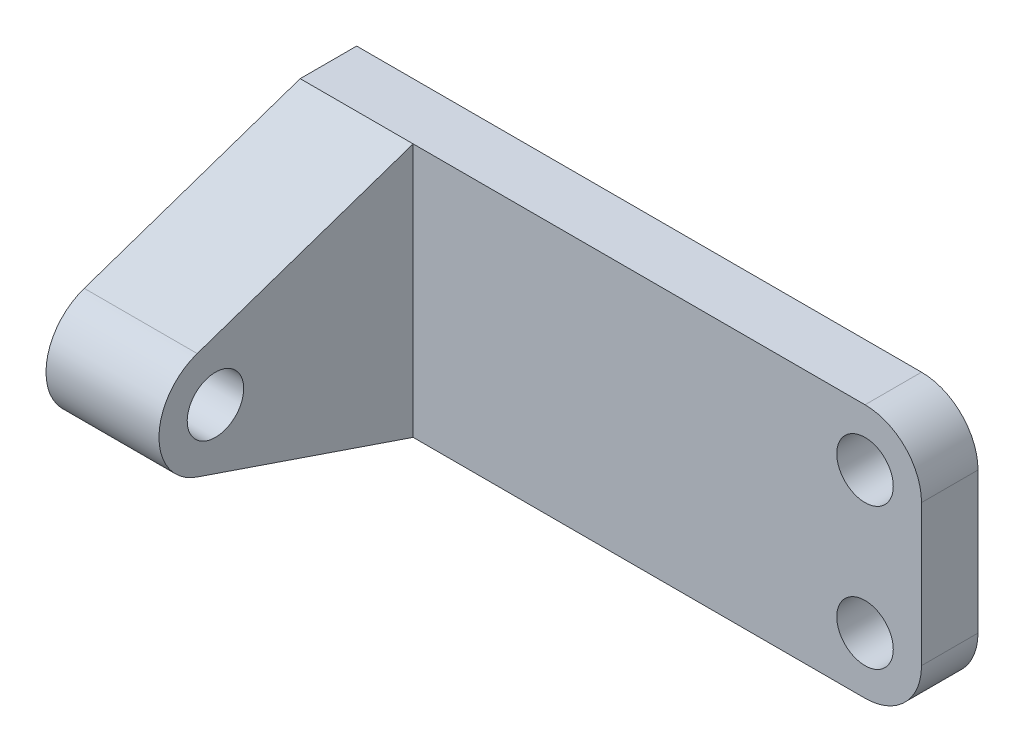
ISO-10303-21;
HEADER;
FILE_DESCRIPTION(('STEP AP214'),'2;1');
FILE_NAME('part.step','',(''),(''),'','','');
FILE_SCHEMA(('AUTOMOTIVE_DESIGN { 1 0 10303 214 1 1 1 1 }'));
ENDSEC;
DATA;
#1=APPLICATION_CONTEXT('core data for automotive mechanical design processes');
#2=APPLICATION_PROTOCOL_DEFINITION('international standard','automotive_design',2000,#1);
#3=PRODUCT_CONTEXT('',#1,'mechanical');
#4=PRODUCT('Part','Part','',(#3));
#5=PRODUCT_RELATED_PRODUCT_CATEGORY('part','',(#4));
#6=PRODUCT_DEFINITION_FORMATION('','',#4);
#7=PRODUCT_DEFINITION_CONTEXT('part definition',#1,'design');
#8=PRODUCT_DEFINITION('design','',#6,#7);
#9=PRODUCT_DEFINITION_SHAPE('','',#8);
#10=(LENGTH_UNIT() NAMED_UNIT(*) SI_UNIT(.MILLI.,.METRE.));
#11=(NAMED_UNIT(*) PLANE_ANGLE_UNIT() SI_UNIT($,.RADIAN.));
#12=(NAMED_UNIT(*) SI_UNIT($,.STERADIAN.) SOLID_ANGLE_UNIT());
#13=UNCERTAINTY_MEASURE_WITH_UNIT(LENGTH_MEASURE(1.E-05),#10,'distance_accuracy_value','');
#14=(GEOMETRIC_REPRESENTATION_CONTEXT(3) GLOBAL_UNCERTAINTY_ASSIGNED_CONTEXT((#13)) GLOBAL_UNIT_ASSIGNED_CONTEXT((#10,
#11,#12)) REPRESENTATION_CONTEXT('',''));
#15=CARTESIAN_POINT('',(0.,0.,0.));
#16=DIRECTION('',(0.,0.,1.));
#17=DIRECTION('',(1.,0.,0.));
#18=AXIS2_PLACEMENT_3D('',#15,#16,#17);
#19=CARTESIAN_POINT('',(72.8066933620451,58.039109346701,12.7));
#20=DIRECTION('',(0.,0.,1.));
#21=DIRECTION('',(1.,0.,0.));
#22=AXIS2_PLACEMENT_3D('',#19,#20,#21);
#23=PLANE('',#22);
#24=DIRECTION('',(0.,1.,0.));
#25=VECTOR('',#24,1.);
#26=CARTESIAN_POINT('',(-28.7933066379549,0.,12.7));
#27=LINE('',#26,#25);
#28=CARTESIAN_POINT('',(-28.7933066379549,13.589109346701,12.7));
#29=VERTEX_POINT('',#28);
#30=CARTESIAN_POINT('',(-28.7933066379549,70.7391093467009,12.7));
#31=VERTEX_POINT('',#30);
#32=EDGE_CURVE('E56',#29,#31,#27,.T.);
#33=ORIENTED_EDGE('',*,*,#32,.F.);
#34=DIRECTION('',(1.,0.,0.));
#35=VECTOR('',#34,1.);
#36=CARTESIAN_POINT('',(-54.1933066379549,13.589109346701,12.7));
#37=LINE('',#36,#35);
#38=CARTESIAN_POINT('',(72.8066933620451,13.589109346701,12.7));
#39=VERTEX_POINT('',#38);
#40=EDGE_CURVE('E107',#29,#39,#37,.T.);
#41=ORIENTED_EDGE('',*,*,#40,.T.);
#42=CARTESIAN_POINT('',(72.8066933620451,26.289109346701,12.7));
#43=DIRECTION('',(0.,0.,1.));
#44=DIRECTION('',(1.,0.,0.));
#45=AXIS2_PLACEMENT_3D('',#42,#43,#44);
#46=CIRCLE('',#45,12.7);
#47=CARTESIAN_POINT('',(85.5066933620451,26.289109346701,12.7));
#48=VERTEX_POINT('',#47);
#49=EDGE_CURVE('E111',#39,#48,#46,.T.);
#50=ORIENTED_EDGE('',*,*,#49,.T.);
#51=DIRECTION('',(0.,1.,0.));
#52=VECTOR('',#51,1.);
#53=CARTESIAN_POINT('',(85.5066933620451,58.039109346701,12.7));
#54=LINE('',#53,#52);
#55=CARTESIAN_POINT('',(85.5066933620451,58.039109346701,12.7));
#56=VERTEX_POINT('',#55);
#57=EDGE_CURVE('E64',#48,#56,#54,.T.);
#58=ORIENTED_EDGE('',*,*,#57,.T.);
#59=CARTESIAN_POINT('',(72.8066933620451,58.039109346701,12.7));
#60=DIRECTION('',(0.,0.,1.));
#61=DIRECTION('',(1.,0.,0.));
#62=AXIS2_PLACEMENT_3D('',#59,#60,#61);
#63=CIRCLE('',#62,12.7);
#64=CARTESIAN_POINT('',(72.8066933620451,70.739109346701,12.7));
#65=VERTEX_POINT('',#64);
#66=EDGE_CURVE('E150',#56,#65,#63,.T.);
#67=ORIENTED_EDGE('',*,*,#66,.T.);
#68=DIRECTION('',(-1.,0.,0.));
#69=VECTOR('',#68,1.);
#70=CARTESIAN_POINT('',(72.8066933620451,70.739109346701,12.7));
#71=LINE('',#70,#69);
#72=EDGE_CURVE('E98',#65,#31,#71,.T.);
#73=ORIENTED_EDGE('',*,*,#72,.T.);
#74=EDGE_LOOP('',(#33,#41,#50,#58,#67,#73));
#75=FACE_BOUND('',#74,.T.);
#76=CARTESIAN_POINT('',(72.8066933620451,58.039109346701,12.7));
#77=DIRECTION('',(0.,0.,1.));
#78=DIRECTION('',(1.,0.,0.));
#79=AXIS2_PLACEMENT_3D('',#76,#77,#78);
#80=CIRCLE('',#79,6.35);
#81=CARTESIAN_POINT('',(79.1566933620451,58.039109346701,12.7));
#82=VERTEX_POINT('',#81);
#83=EDGE_CURVE('E142',#82,#82,#80,.T.);
#84=ORIENTED_EDGE('',*,*,#83,.F.);
#85=EDGE_LOOP('',(#84));
#86=FACE_BOUND('',#85,.T.);
#87=CARTESIAN_POINT('',(72.8066933620451,26.289109346701,12.7));
#88=DIRECTION('',(0.,0.,1.));
#89=DIRECTION('',(1.,0.,0.));
#90=AXIS2_PLACEMENT_3D('',#87,#88,#89);
#91=CIRCLE('',#90,6.35);
#92=CARTESIAN_POINT('',(79.1566933620451,26.289109346701,12.7));
#93=VERTEX_POINT('',#92);
#94=EDGE_CURVE('E162',#93,#93,#91,.T.);
#95=ORIENTED_EDGE('',*,*,#94,.F.);
#96=EDGE_LOOP('',(#95));
#97=FACE_BOUND('',#96,.T.);
#98=ADVANCED_FACE('F39',(#75,#86,#97),#23,.T.);
#99=CARTESIAN_POINT('',(72.8066933620451,58.039109346701,0.));
#100=DIRECTION('',(0.,0.,1.));
#101=DIRECTION('',(1.,0.,0.));
#102=AXIS2_PLACEMENT_3D('',#99,#100,#101);
#103=PLANE('',#102);
#104=CARTESIAN_POINT('',(72.8066933620451,58.039109346701,0.));
#105=DIRECTION('',(0.,0.,1.));
#106=DIRECTION('',(1.,0.,0.));
#107=AXIS2_PLACEMENT_3D('',#104,#105,#106);
#108=CIRCLE('',#107,12.7);
#109=CARTESIAN_POINT('',(85.5066933620451,58.039109346701,0.));
#110=VERTEX_POINT('',#109);
#111=CARTESIAN_POINT('',(72.8066933620451,70.739109346701,0.));
#112=VERTEX_POINT('',#111);
#113=EDGE_CURVE('E138',#110,#112,#108,.T.);
#114=ORIENTED_EDGE('',*,*,#113,.F.);
#115=DIRECTION('',(0.,1.,0.));
#116=VECTOR('',#115,1.);
#117=CARTESIAN_POINT('',(85.5066933620451,58.039109346701,0.));
#118=LINE('',#117,#116);
#119=CARTESIAN_POINT('',(85.5066933620451,26.289109346701,0.));
#120=VERTEX_POINT('',#119);
#121=EDGE_CURVE('E91',#120,#110,#118,.T.);
#122=ORIENTED_EDGE('',*,*,#121,.F.);
#123=CARTESIAN_POINT('',(72.8066933620451,26.289109346701,0.));
#124=DIRECTION('',(0.,0.,1.));
#125=DIRECTION('',(1.,0.,0.));
#126=AXIS2_PLACEMENT_3D('',#123,#124,#125);
#127=CIRCLE('',#126,12.7);
#128=CARTESIAN_POINT('',(72.8066933620451,13.589109346701,0.));
#129=VERTEX_POINT('',#128);
#130=EDGE_CURVE('E147',#129,#120,#127,.T.);
#131=ORIENTED_EDGE('',*,*,#130,.F.);
#132=DIRECTION('',(1.,0.,0.));
#133=VECTOR('',#132,1.);
#134=CARTESIAN_POINT('',(-54.1933066379549,13.589109346701,0.));
#135=LINE('',#134,#133);
#136=CARTESIAN_POINT('',(-54.1933066379549,13.589109346701,0.));
#137=VERTEX_POINT('',#136);
#138=EDGE_CURVE('E123',#137,#129,#135,.T.);
#139=ORIENTED_EDGE('',*,*,#138,.F.);
#140=DIRECTION('',(0.,-1.,0.));
#141=VECTOR('',#140,1.);
#142=CARTESIAN_POINT('',(-54.1933066379549,70.7391093467009,0.));
#143=LINE('',#142,#141);
#144=CARTESIAN_POINT('',(-54.1933066379549,70.7391093467009,0.));
#145=VERTEX_POINT('',#144);
#146=EDGE_CURVE('E144',#145,#137,#143,.T.);
#147=ORIENTED_EDGE('',*,*,#146,.F.);
#148=DIRECTION('',(-1.,0.,0.));
#149=VECTOR('',#148,1.);
#150=CARTESIAN_POINT('',(72.8066933620451,70.739109346701,0.));
#151=LINE('',#150,#149);
#152=EDGE_CURVE('E141',#112,#145,#151,.T.);
#153=ORIENTED_EDGE('',*,*,#152,.F.);
#154=EDGE_LOOP('',(#114,#122,#131,#139,#147,#153));
#155=FACE_BOUND('',#154,.T.);
#156=CARTESIAN_POINT('',(72.8066933620451,58.039109346701,0.));
#157=DIRECTION('',(0.,0.,1.));
#158=DIRECTION('',(1.,0.,0.));
#159=AXIS2_PLACEMENT_3D('',#156,#157,#158);
#160=CIRCLE('',#159,6.35);
#161=CARTESIAN_POINT('',(79.1566933620451,58.039109346701,0.));
#162=VERTEX_POINT('',#161);
#163=EDGE_CURVE('E159',#162,#162,#160,.T.);
#164=ORIENTED_EDGE('',*,*,#163,.T.);
#165=EDGE_LOOP('',(#164));
#166=FACE_BOUND('',#165,.T.);
#167=CARTESIAN_POINT('',(72.8066933620451,26.289109346701,0.));
#168=DIRECTION('',(0.,0.,1.));
#169=DIRECTION('',(1.,0.,0.));
#170=AXIS2_PLACEMENT_3D('',#167,#168,#169);
#171=CIRCLE('',#170,6.35);
#172=CARTESIAN_POINT('',(79.1566933620451,26.289109346701,0.));
#173=VERTEX_POINT('',#172);
#174=EDGE_CURVE('E165',#173,#173,#171,.T.);
#175=ORIENTED_EDGE('',*,*,#174,.T.);
#176=EDGE_LOOP('',(#175));
#177=FACE_BOUND('',#176,.T.);
#178=ADVANCED_FACE('F234',(#155,#166,#177),#103,.F.);
#179=CARTESIAN_POINT('',(72.8066933620451,58.039109346701,12.7));
#180=DIRECTION('',(0.,0.,-1.));
#181=DIRECTION('',(-1.,0.,0.));
#182=AXIS2_PLACEMENT_3D('',#179,#180,#181);
#183=CYLINDRICAL_SURFACE('',#182,12.7);
#184=ORIENTED_EDGE('',*,*,#113,.T.);
#185=DIRECTION('',(0.,0.,-1.));
#186=VECTOR('',#185,1.);
#187=CARTESIAN_POINT('',(72.8066933620451,70.739109346701,12.7));
#188=LINE('',#187,#186);
#189=EDGE_CURVE('E11',#65,#112,#188,.T.);
#190=ORIENTED_EDGE('',*,*,#189,.F.);
#191=ORIENTED_EDGE('',*,*,#66,.F.);
#192=DIRECTION('',(0.,0.,-1.));
#193=VECTOR('',#192,1.);
#194=CARTESIAN_POINT('',(85.5066933620451,58.039109346701,12.7));
#195=LINE('',#194,#193);
#196=EDGE_CURVE('E131',#56,#110,#195,.T.);
#197=ORIENTED_EDGE('',*,*,#196,.T.);
#198=EDGE_LOOP('',(#184,#190,#191,#197));
#199=FACE_BOUND('',#198,.T.);
#200=ADVANCED_FACE('F41',(#199),#183,.T.);
#201=CARTESIAN_POINT('',(72.8066933620451,70.739109346701,12.7));
#202=DIRECTION('',(0.,-1.,0.));
#203=DIRECTION('',(1.,0.,0.));
#204=AXIS2_PLACEMENT_3D('',#201,#202,#203);
#205=PLANE('',#204);
#206=ORIENTED_EDGE('',*,*,#152,.T.);
#207=DIRECTION('',(0.,0.,-1.));
#208=VECTOR('',#207,1.);
#209=CARTESIAN_POINT('',(-54.1933066379549,70.7391093467009,12.7));
#210=LINE('',#209,#208);
#211=CARTESIAN_POINT('',(-54.1933066379549,70.7391093467009,12.7));
#212=VERTEX_POINT('',#211);
#213=EDGE_CURVE('E48',#212,#145,#210,.T.);
#214=ORIENTED_EDGE('',*,*,#213,.F.);
#215=DIRECTION('',(-1.,0.,0.));
#216=VECTOR('',#215,1.);
#217=CARTESIAN_POINT('',(-28.7933066379549,70.7391093467009,12.7));
#218=LINE('',#217,#216);
#219=EDGE_CURVE('E168',#31,#212,#218,.T.);
#220=ORIENTED_EDGE('',*,*,#219,.F.);
#221=ORIENTED_EDGE('',*,*,#72,.F.);
#222=ORIENTED_EDGE('',*,*,#189,.T.);
#223=EDGE_LOOP('',(#206,#214,#220,#221,#222));
#224=FACE_BOUND('',#223,.T.);
#225=ADVANCED_FACE('F225',(#224),#205,.F.);
#226=CARTESIAN_POINT('',(-54.1933066379549,70.7391093467009,12.7));
#227=DIRECTION('',(1.,0.,0.));
#228=DIRECTION('',(0.,1.,0.));
#229=AXIS2_PLACEMENT_3D('',#226,#227,#228);
#230=PLANE('',#229);
#231=ORIENTED_EDGE('',*,*,#146,.T.);
#232=DIRECTION('',(0.,0.,-1.));
#233=VECTOR('',#232,1.);
#234=CARTESIAN_POINT('',(-54.1933066379549,13.589109346701,12.7));
#235=LINE('',#234,#233);
#236=CARTESIAN_POINT('',(-54.1933066379549,13.589109346701,12.7));
#237=VERTEX_POINT('',#236);
#238=EDGE_CURVE('E126',#237,#137,#235,.T.);
#239=ORIENTED_EDGE('',*,*,#238,.F.);
#240=DIRECTION('',(0.,0.32274169600228,0.946487082670214));
#241=VECTOR('',#240,1.);
#242=CARTESIAN_POINT('',(-54.1933066379549,8.29415804125437,-2.82821676297309));
#243=LINE('',#242,#241);
#244=CARTESIAN_POINT('',(-54.1933066379549,30.1437233967893,61.248819539229));
#245=VERTEX_POINT('',#244);
#246=EDGE_CURVE('E184',#237,#245,#243,.T.);
#247=ORIENTED_EDGE('',*,*,#246,.T.);
#248=CARTESIAN_POINT('',(-54.1933066379549,42.164109346701,57.15));
#249=DIRECTION('',(-1.,0.,0.));
#250=DIRECTION('',(0.,-1.,0.));
#251=AXIS2_PLACEMENT_3D('',#248,#249,#250);
#252=CIRCLE('',#251,12.7);
#253=CARTESIAN_POINT('',(-54.1933066379549,54.1844952966127,61.2488195392289));
#254=VERTEX_POINT('',#253);
#255=EDGE_CURVE('E181',#245,#254,#252,.T.);
#256=ORIENTED_EDGE('',*,*,#255,.T.);
#257=DIRECTION('',(0.,-0.32274169600228,0.946487082670214));
#258=VECTOR('',#257,1.);
#259=CARTESIAN_POINT('',(-54.1933066379549,67.2502476737662,22.9315955687133));
#260=LINE('',#259,#258);
#261=EDGE_CURVE('E177',#212,#254,#260,.T.);
#262=ORIENTED_EDGE('',*,*,#261,.F.);
#263=ORIENTED_EDGE('',*,*,#213,.T.);
#264=EDGE_LOOP('',(#231,#239,#247,#256,#262,#263));
#265=FACE_BOUND('',#264,.T.);
#266=CARTESIAN_POINT('',(-54.1933066379549,42.164109346701,57.15));
#267=DIRECTION('',(-1.,0.,0.));
#268=DIRECTION('',(0.,-1.,0.));
#269=AXIS2_PLACEMENT_3D('',#266,#267,#268);
#270=CIRCLE('',#269,6.35);
#271=CARTESIAN_POINT('',(-54.1933066379549,35.814109346701,57.15));
#272=VERTEX_POINT('',#271);
#273=EDGE_CURVE('E187',#272,#272,#270,.T.);
#274=ORIENTED_EDGE('',*,*,#273,.F.);
#275=EDGE_LOOP('',(#274));
#276=FACE_BOUND('',#275,.T.);
#277=ADVANCED_FACE('F223',(#265,#276),#230,.F.);
#278=CARTESIAN_POINT('',(-54.1933066379549,13.589109346701,12.7));
#279=DIRECTION('',(0.,1.,0.));
#280=DIRECTION('',(-1.,0.,0.));
#281=AXIS2_PLACEMENT_3D('',#278,#279,#280);
#282=PLANE('',#281);
#283=ORIENTED_EDGE('',*,*,#138,.T.);
#284=DIRECTION('',(0.,0.,-1.));
#285=VECTOR('',#284,1.);
#286=CARTESIAN_POINT('',(72.8066933620451,13.589109346701,12.7));
#287=LINE('',#286,#285);
#288=EDGE_CURVE('E119',#39,#129,#287,.T.);
#289=ORIENTED_EDGE('',*,*,#288,.F.);
#290=ORIENTED_EDGE('',*,*,#40,.F.);
#291=EDGE_CURVE('E116',#237,#29,#37,.T.);
#292=ORIENTED_EDGE('',*,*,#291,.F.);
#293=ORIENTED_EDGE('',*,*,#238,.T.);
#294=EDGE_LOOP('',(#283,#289,#290,#292,#293));
#295=FACE_BOUND('',#294,.T.);
#296=ADVANCED_FACE('F120',(#295),#282,.F.);
#297=CARTESIAN_POINT('',(72.8066933620451,26.289109346701,12.7));
#298=DIRECTION('',(0.,0.,-1.));
#299=DIRECTION('',(-1.,0.,0.));
#300=AXIS2_PLACEMENT_3D('',#297,#298,#299);
#301=CYLINDRICAL_SURFACE('',#300,12.7);
#302=ORIENTED_EDGE('',*,*,#130,.T.);
#303=DIRECTION('',(0.,0.,-1.));
#304=VECTOR('',#303,1.);
#305=CARTESIAN_POINT('',(85.5066933620451,26.289109346701,12.7));
#306=LINE('',#305,#304);
#307=EDGE_CURVE('E127',#48,#120,#306,.T.);
#308=ORIENTED_EDGE('',*,*,#307,.F.);
#309=ORIENTED_EDGE('',*,*,#49,.F.);
#310=ORIENTED_EDGE('',*,*,#288,.T.);
#311=EDGE_LOOP('',(#302,#308,#309,#310));
#312=FACE_BOUND('',#311,.T.);
#313=ADVANCED_FACE('F129',(#312),#301,.T.);
#314=CARTESIAN_POINT('',(85.5066933620451,58.039109346701,12.7));
#315=DIRECTION('',(-1.,0.,0.));
#316=DIRECTION('',(0.,-1.,0.));
#317=AXIS2_PLACEMENT_3D('',#314,#315,#316);
#318=PLANE('',#317);
#319=ORIENTED_EDGE('',*,*,#121,.T.);
#320=ORIENTED_EDGE('',*,*,#196,.F.);
#321=ORIENTED_EDGE('',*,*,#57,.F.);
#322=ORIENTED_EDGE('',*,*,#307,.T.);
#323=EDGE_LOOP('',(#319,#320,#321,#322));
#324=FACE_BOUND('',#323,.T.);
#325=ADVANCED_FACE('F245',(#324),#318,.F.);
#326=CARTESIAN_POINT('',(72.8066933620451,58.039109346701,12.7));
#327=DIRECTION('',(0.,0.,-1.));
#328=DIRECTION('',(-1.,0.,0.));
#329=AXIS2_PLACEMENT_3D('',#326,#327,#328);
#330=CYLINDRICAL_SURFACE('',#329,6.35);
#331=ORIENTED_EDGE('',*,*,#83,.T.);
#332=EDGE_LOOP('',(#331));
#333=FACE_BOUND('',#332,.T.);
#334=ORIENTED_EDGE('',*,*,#163,.F.);
#335=EDGE_LOOP('',(#334));
#336=FACE_BOUND('',#335,.T.);
#337=ADVANCED_FACE('F242',(#333,#336),#330,.F.);
#338=CARTESIAN_POINT('',(72.8066933620451,26.289109346701,12.7));
#339=DIRECTION('',(0.,0.,-1.));
#340=DIRECTION('',(-1.,0.,0.));
#341=AXIS2_PLACEMENT_3D('',#338,#339,#340);
#342=CYLINDRICAL_SURFACE('',#341,6.35);
#343=ORIENTED_EDGE('',*,*,#94,.T.);
#344=EDGE_LOOP('',(#343));
#345=FACE_BOUND('',#344,.T.);
#346=ORIENTED_EDGE('',*,*,#174,.F.);
#347=EDGE_LOOP('',(#346));
#348=FACE_BOUND('',#347,.T.);
#349=ADVANCED_FACE('F264',(#345,#348),#342,.F.);
#350=CARTESIAN_POINT('',(-28.7933066379549,8.29415804125438,-2.82821676297309));
#351=DIRECTION('',(0.,-0.946487082670214,0.32274169600228));
#352=DIRECTION('',(0.,-0.32274169600228,-0.946487082670214));
#353=AXIS2_PLACEMENT_3D('',#350,#351,#352);
#354=PLANE('',#353);
#355=ORIENTED_EDGE('',*,*,#246,.F.);
#356=ORIENTED_EDGE('',*,*,#291,.T.);
#357=DIRECTION('',(0.,0.32274169600228,0.946487082670214));
#358=VECTOR('',#357,1.);
#359=CARTESIAN_POINT('',(-28.7933066379549,8.29415804125438,-2.82821676297309));
#360=LINE('',#359,#358);
#361=CARTESIAN_POINT('',(-28.7933066379549,30.1437233967893,61.248819539229));
#362=VERTEX_POINT('',#361);
#363=EDGE_CURVE('E203',#29,#362,#360,.T.);
#364=ORIENTED_EDGE('',*,*,#363,.T.);
#365=DIRECTION('',(-1.,0.,0.));
#366=VECTOR('',#365,1.);
#367=CARTESIAN_POINT('',(-28.7933066379549,30.1437233967893,61.248819539229));
#368=LINE('',#367,#366);
#369=EDGE_CURVE('E171',#362,#245,#368,.T.);
#370=ORIENTED_EDGE('',*,*,#369,.T.);
#371=EDGE_LOOP('',(#355,#356,#364,#370));
#372=FACE_BOUND('',#371,.T.);
#373=ADVANCED_FACE('F271',(#372),#354,.T.);
#374=CARTESIAN_POINT('',(-28.7933066379549,67.2502476737662,22.9315955687133));
#375=DIRECTION('',(0.,-0.946487082670214,-0.32274169600228));
#376=DIRECTION('',(0.,0.32274169600228,-0.946487082670214));
#377=AXIS2_PLACEMENT_3D('',#374,#375,#376);
#378=PLANE('',#377);
#379=ORIENTED_EDGE('',*,*,#261,.T.);
#380=DIRECTION('',(-1.,0.,0.));
#381=VECTOR('',#380,1.);
#382=CARTESIAN_POINT('',(-28.7933066379549,54.1844952966127,61.2488195392289));
#383=LINE('',#382,#381);
#384=CARTESIAN_POINT('',(-28.7933066379549,54.1844952966127,61.2488195392289));
#385=VERTEX_POINT('',#384);
#386=EDGE_CURVE('E174',#385,#254,#383,.T.);
#387=ORIENTED_EDGE('',*,*,#386,.F.);
#388=DIRECTION('',(0.,-0.32274169600228,0.946487082670214));
#389=VECTOR('',#388,1.);
#390=CARTESIAN_POINT('',(-28.7933066379549,67.2502476737662,22.9315955687133));
#391=LINE('',#390,#389);
#392=EDGE_CURVE('E197',#31,#385,#391,.T.);
#393=ORIENTED_EDGE('',*,*,#392,.F.);
#394=ORIENTED_EDGE('',*,*,#219,.T.);
#395=EDGE_LOOP('',(#379,#387,#393,#394));
#396=FACE_BOUND('',#395,.T.);
#397=ADVANCED_FACE('F219',(#396),#378,.F.);
#398=CARTESIAN_POINT('',(-28.7933066379549,42.164109346701,57.15));
#399=DIRECTION('',(-1.,0.,0.));
#400=DIRECTION('',(0.,-1.,0.));
#401=AXIS2_PLACEMENT_3D('',#398,#399,#400);
#402=CYLINDRICAL_SURFACE('',#401,6.35);
#403=CARTESIAN_POINT('',(-28.7933066379549,42.164109346701,57.15));
#404=DIRECTION('',(-1.,0.,0.));
#405=DIRECTION('',(0.,-1.,0.));
#406=AXIS2_PLACEMENT_3D('',#403,#404,#405);
#407=CIRCLE('',#406,6.35);
#408=CARTESIAN_POINT('',(-28.7933066379549,35.814109346701,57.15));
#409=VERTEX_POINT('',#408);
#410=EDGE_CURVE('E180',#409,#409,#407,.T.);
#411=ORIENTED_EDGE('',*,*,#410,.F.);
#412=EDGE_LOOP('',(#411));
#413=FACE_BOUND('',#412,.T.);
#414=ORIENTED_EDGE('',*,*,#273,.T.);
#415=EDGE_LOOP('',(#414));
#416=FACE_BOUND('',#415,.T.);
#417=ADVANCED_FACE('F215',(#413,#416),#402,.F.);
#418=CARTESIAN_POINT('',(-28.7933066379549,42.164109346701,57.15));
#419=DIRECTION('',(-1.,0.,0.));
#420=DIRECTION('',(0.,-1.,0.));
#421=AXIS2_PLACEMENT_3D('',#418,#419,#420);
#422=CYLINDRICAL_SURFACE('',#421,12.7);
#423=ORIENTED_EDGE('',*,*,#255,.F.);
#424=ORIENTED_EDGE('',*,*,#369,.F.);
#425=CARTESIAN_POINT('',(-28.7933066379549,42.164109346701,57.15));
#426=DIRECTION('',(-1.,0.,0.));
#427=DIRECTION('',(0.,-1.,0.));
#428=AXIS2_PLACEMENT_3D('',#425,#426,#427);
#429=CIRCLE('',#428,12.7);
#430=EDGE_CURVE('E192',#362,#385,#429,.T.);
#431=ORIENTED_EDGE('',*,*,#430,.T.);
#432=ORIENTED_EDGE('',*,*,#386,.T.);
#433=EDGE_LOOP('',(#423,#424,#431,#432));
#434=FACE_BOUND('',#433,.T.);
#435=ADVANCED_FACE('F218',(#434),#422,.T.);
#436=CARTESIAN_POINT('',(-28.7933066379549,0.,0.));
#437=DIRECTION('',(-1.,0.,0.));
#438=DIRECTION('',(0.,-1.,0.));
#439=AXIS2_PLACEMENT_3D('',#436,#437,#438);
#440=PLANE('',#439);
#441=ORIENTED_EDGE('',*,*,#410,.T.);
#442=EDGE_LOOP('',(#441));
#443=FACE_BOUND('',#442,.T.);
#444=ORIENTED_EDGE('',*,*,#363,.F.);
#445=ORIENTED_EDGE('',*,*,#32,.T.);
#446=ORIENTED_EDGE('',*,*,#392,.T.);
#447=ORIENTED_EDGE('',*,*,#430,.F.);
#448=EDGE_LOOP('',(#444,#445,#446,#447));
#449=FACE_BOUND('',#448,.T.);
#450=ADVANCED_FACE('F212',(#443,#449),#440,.F.);
#451=CLOSED_SHELL('',(#98,#178,#200,#225,#277,#296,#313,#325,#337,#349,#373,#397,#417,#435,#450));
#452=MANIFOLD_SOLID_BREP('B2',#451);
#453=ADVANCED_BREP_SHAPE_REPRESENTATION('',(#18,#452),#14);
#454=SHAPE_DEFINITION_REPRESENTATION(#9,#453);
ENDSEC;
END-ISO-10303-21;
